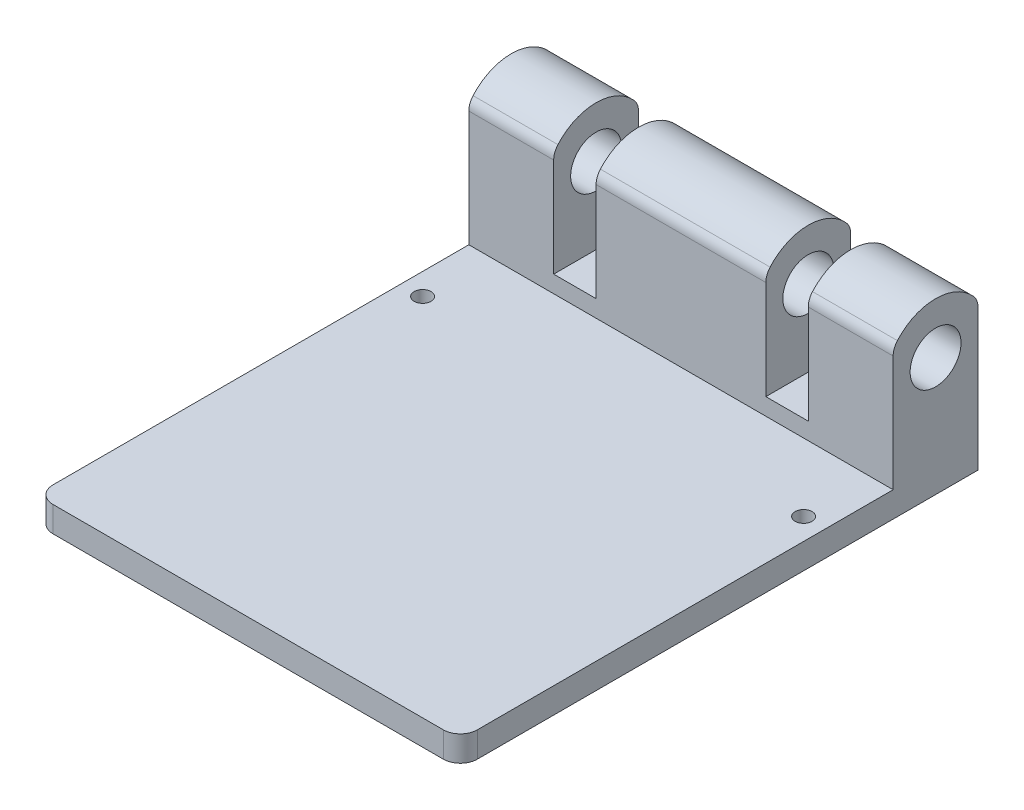
ISO-10303-21;
HEADER;
FILE_DESCRIPTION(('STEP AP214'),'2;1');
FILE_NAME('part.step','',(''),(''),'','','');
FILE_SCHEMA(('AUTOMOTIVE_DESIGN { 1 0 10303 214 1 1 1 1 }'));
ENDSEC;
DATA;
#1=APPLICATION_CONTEXT('core data for automotive mechanical design processes');
#2=APPLICATION_PROTOCOL_DEFINITION('international standard','automotive_design',2000,#1);
#3=PRODUCT_CONTEXT('',#1,'mechanical');
#4=PRODUCT('Part','Part','',(#3));
#5=PRODUCT_RELATED_PRODUCT_CATEGORY('part','',(#4));
#6=PRODUCT_DEFINITION_FORMATION('','',#4);
#7=PRODUCT_DEFINITION_CONTEXT('part definition',#1,'design');
#8=PRODUCT_DEFINITION('design','',#6,#7);
#9=PRODUCT_DEFINITION_SHAPE('','',#8);
#10=(LENGTH_UNIT() NAMED_UNIT(*) SI_UNIT(.MILLI.,.METRE.));
#11=(NAMED_UNIT(*) PLANE_ANGLE_UNIT() SI_UNIT($,.RADIAN.));
#12=(NAMED_UNIT(*) SI_UNIT($,.STERADIAN.) SOLID_ANGLE_UNIT());
#13=UNCERTAINTY_MEASURE_WITH_UNIT(LENGTH_MEASURE(1.E-05),#10,'distance_accuracy_value','');
#14=(GEOMETRIC_REPRESENTATION_CONTEXT(3) GLOBAL_UNCERTAINTY_ASSIGNED_CONTEXT((#13)) GLOBAL_UNIT_ASSIGNED_CONTEXT((#10,
#11,#12)) REPRESENTATION_CONTEXT('',''));
#15=CARTESIAN_POINT('',(0.,0.,0.));
#16=DIRECTION('',(0.,0.,1.));
#17=DIRECTION('',(1.,0.,0.));
#18=AXIS2_PLACEMENT_3D('',#15,#16,#17);
#19=CARTESIAN_POINT('',(25.,20.,5.));
#20=DIRECTION('',(0.,0.,-1.));
#21=DIRECTION('',(-1.,0.,0.));
#22=AXIS2_PLACEMENT_3D('',#19,#20,#21);
#23=PLANE('',#22);
#24=DIRECTION('',(1.,0.,0.));
#25=VECTOR('',#24,1.);
#26=CARTESIAN_POINT('',(-25.,3.,5.));
#27=LINE('',#26,#25);
#28=CARTESIAN_POINT('',(-25.,3.,5.));
#29=VERTEX_POINT('',#28);
#30=CARTESIAN_POINT('',(25.,3.,5.));
#31=VERTEX_POINT('',#30);
#32=EDGE_CURVE('E54',#29,#31,#27,.T.);
#33=ORIENTED_EDGE('',*,*,#32,.T.);
#34=DIRECTION('',(0.,-1.,0.));
#35=VECTOR('',#34,1.);
#36=CARTESIAN_POINT('',(25.,20.,5.));
#37=LINE('',#36,#35);
#38=CARTESIAN_POINT('',(25.,16.6457513110646,5.));
#39=VERTEX_POINT('',#38);
#40=EDGE_CURVE('E301',#39,#31,#37,.T.);
#41=ORIENTED_EDGE('',*,*,#40,.F.);
#42=DIRECTION('',(-1.,0.,0.));
#43=VECTOR('',#42,1.);
#44=CARTESIAN_POINT('',(-45.,16.6457513110646,5.00000000000001));
#45=LINE('',#44,#43);
#46=CARTESIAN_POINT('',(15.,16.6457513110646,5.));
#47=VERTEX_POINT('',#46);
#48=EDGE_CURVE('E344',#39,#47,#45,.T.);
#49=ORIENTED_EDGE('',*,*,#48,.T.);
#50=DIRECTION('',(0.,-1.,0.));
#51=VECTOR('',#50,1.);
#52=CARTESIAN_POINT('',(15.,20.,5.));
#53=LINE('',#52,#51);
#54=CARTESIAN_POINT('',(15.,5.,5.));
#55=VERTEX_POINT('',#54);
#56=EDGE_CURVE('E252',#47,#55,#53,.T.);
#57=ORIENTED_EDGE('',*,*,#56,.T.);
#58=DIRECTION('',(1.,0.,0.));
#59=VECTOR('',#58,1.);
#60=CARTESIAN_POINT('',(9.99999999999999,5.,5.));
#61=LINE('',#60,#59);
#62=CARTESIAN_POINT('',(9.99999999999999,5.,5.));
#63=VERTEX_POINT('',#62);
#64=EDGE_CURVE('E256',#63,#55,#61,.T.);
#65=ORIENTED_EDGE('',*,*,#64,.F.);
#66=DIRECTION('',(0.,-1.,0.));
#67=VECTOR('',#66,1.);
#68=CARTESIAN_POINT('',(10.,20.,5.));
#69=LINE('',#68,#67);
#70=CARTESIAN_POINT('',(10.,16.6457513110646,5.));
#71=VERTEX_POINT('',#70);
#72=EDGE_CURVE('E237',#71,#63,#69,.T.);
#73=ORIENTED_EDGE('',*,*,#72,.F.);
#74=DIRECTION('',(-1.,0.,0.));
#75=VECTOR('',#74,1.);
#76=CARTESIAN_POINT('',(-45.,16.6457513110646,5.00000000000001));
#77=LINE('',#76,#75);
#78=CARTESIAN_POINT('',(-10.,16.6457513110646,5.));
#79=VERTEX_POINT('',#78);
#80=EDGE_CURVE('E335',#71,#79,#77,.T.);
#81=ORIENTED_EDGE('',*,*,#80,.T.);
#82=DIRECTION('',(0.,-1.,0.));
#83=VECTOR('',#82,1.);
#84=CARTESIAN_POINT('',(-10.,20.,5.));
#85=LINE('',#84,#83);
#86=CARTESIAN_POINT('',(-10.,5.,5.));
#87=VERTEX_POINT('',#86);
#88=EDGE_CURVE('E234',#79,#87,#85,.T.);
#89=ORIENTED_EDGE('',*,*,#88,.T.);
#90=DIRECTION('',(1.,0.,0.));
#91=VECTOR('',#90,1.);
#92=CARTESIAN_POINT('',(-15.,5.,5.));
#93=LINE('',#92,#91);
#94=CARTESIAN_POINT('',(-15.,5.,5.));
#95=VERTEX_POINT('',#94);
#96=EDGE_CURVE('E236',#95,#87,#93,.T.);
#97=ORIENTED_EDGE('',*,*,#96,.F.);
#98=DIRECTION('',(0.,-1.,0.));
#99=VECTOR('',#98,1.);
#100=CARTESIAN_POINT('',(-15.,20.,5.));
#101=LINE('',#100,#99);
#102=CARTESIAN_POINT('',(-15.,16.6457513110646,5.));
#103=VERTEX_POINT('',#102);
#104=EDGE_CURVE('E240',#103,#95,#101,.T.);
#105=ORIENTED_EDGE('',*,*,#104,.F.);
#106=DIRECTION('',(-1.,0.,0.));
#107=VECTOR('',#106,1.);
#108=CARTESIAN_POINT('',(-45.,16.6457513110646,5.00000000000001));
#109=LINE('',#108,#107);
#110=CARTESIAN_POINT('',(-25.,16.6457513110646,5.));
#111=VERTEX_POINT('',#110);
#112=EDGE_CURVE('E324',#103,#111,#109,.T.);
#113=ORIENTED_EDGE('',*,*,#112,.T.);
#114=DIRECTION('',(0.,-1.,0.));
#115=VECTOR('',#114,1.);
#116=CARTESIAN_POINT('',(-25.,20.,5.));
#117=LINE('',#116,#115);
#118=EDGE_CURVE('E50',#111,#29,#117,.T.);
#119=ORIENTED_EDGE('',*,*,#118,.T.);
#120=EDGE_LOOP('',(#33,#41,#49,#57,#65,#73,#81,#89,#97,#105,#113,#119));
#121=FACE_BOUND('',#120,.T.);
#122=ADVANCED_FACE('F35',(#121),#23,.F.);
#123=CARTESIAN_POINT('',(-45.,16.6457513110646,-2.99999999999999));
#124=DIRECTION('',(1.,0.,0.));
#125=DIRECTION('',(0.,0.,-1.));
#126=AXIS2_PLACEMENT_3D('',#123,#124,#125);
#127=CYLINDRICAL_SURFACE('',#126,2.);
#128=DIRECTION('',(1.,0.,0.));
#129=VECTOR('',#128,1.);
#130=CARTESIAN_POINT('',(-45.,17.9686269665969,-4.49999999999999));
#131=LINE('',#130,#129);
#132=CARTESIAN_POINT('',(-15.,17.9686269665969,-4.49999999999999));
#133=VERTEX_POINT('',#132);
#134=CARTESIAN_POINT('',(-25.,17.9686269665969,-4.49999999999999));
#135=VERTEX_POINT('',#134);
#136=EDGE_CURVE('E374',#133,#135,#131,.F.);
#137=ORIENTED_EDGE('',*,*,#136,.F.);
#138=CARTESIAN_POINT('',(-15.,16.6457513110646,-2.99999999999999));
#139=DIRECTION('',(-1.,0.,0.));
#140=DIRECTION('',(0.,-1.,0.));
#141=AXIS2_PLACEMENT_3D('',#138,#139,#140);
#142=CIRCLE('',#141,2.);
#143=CARTESIAN_POINT('',(-15.,16.6457513110646,-5.));
#144=VERTEX_POINT('',#143);
#145=EDGE_CURVE('E43',#144,#133,#142,.F.);
#146=ORIENTED_EDGE('',*,*,#145,.F.);
#147=DIRECTION('',(-1.,0.,0.));
#148=VECTOR('',#147,1.);
#149=CARTESIAN_POINT('',(-45.,16.6457513110646,-4.99999999999999));
#150=LINE('',#149,#148);
#151=CARTESIAN_POINT('',(-25.,16.6457513110646,-5.));
#152=VERTEX_POINT('',#151);
#153=EDGE_CURVE('E377',#152,#144,#150,.F.);
#154=ORIENTED_EDGE('',*,*,#153,.F.);
#155=CARTESIAN_POINT('',(-25.,16.6457513110646,-2.99999999999999));
#156=DIRECTION('',(1.,0.,0.));
#157=DIRECTION('',(0.,0.,-1.));
#158=AXIS2_PLACEMENT_3D('',#155,#156,#157);
#159=CIRCLE('',#158,2.);
#160=EDGE_CURVE('E11',#135,#152,#159,.F.);
#161=ORIENTED_EDGE('',*,*,#160,.F.);
#162=EDGE_LOOP('',(#137,#146,#154,#161));
#163=FACE_BOUND('',#162,.T.);
#164=ADVANCED_FACE('F37',(#163),#127,.T.);
#165=CARTESIAN_POINT('',(-45.,16.6457513110646,-2.99999999999999));
#166=DIRECTION('',(1.,0.,0.));
#167=DIRECTION('',(0.,0.,-1.));
#168=AXIS2_PLACEMENT_3D('',#165,#166,#167);
#169=CYLINDRICAL_SURFACE('',#168,2.);
#170=DIRECTION('',(1.,0.,0.));
#171=VECTOR('',#170,1.);
#172=CARTESIAN_POINT('',(-45.,17.9686269665969,-4.49999999999999));
#173=LINE('',#172,#171);
#174=CARTESIAN_POINT('',(10.,17.9686269665969,-4.5));
#175=VERTEX_POINT('',#174);
#176=CARTESIAN_POINT('',(-10.,17.9686269665969,-4.49999999999999));
#177=VERTEX_POINT('',#176);
#178=EDGE_CURVE('E363',#175,#177,#173,.F.);
#179=ORIENTED_EDGE('',*,*,#178,.F.);
#180=CARTESIAN_POINT('',(10.,16.6457513110646,-2.99999999999999));
#181=DIRECTION('',(-1.,0.,0.));
#182=DIRECTION('',(0.,-1.,0.));
#183=AXIS2_PLACEMENT_3D('',#180,#181,#182);
#184=CIRCLE('',#183,2.);
#185=CARTESIAN_POINT('',(10.,16.6457513110646,-5.));
#186=VERTEX_POINT('',#185);
#187=EDGE_CURVE('E372',#186,#175,#184,.F.);
#188=ORIENTED_EDGE('',*,*,#187,.F.);
#189=DIRECTION('',(-1.,0.,0.));
#190=VECTOR('',#189,1.);
#191=CARTESIAN_POINT('',(-45.,16.6457513110646,-4.99999999999999));
#192=LINE('',#191,#190);
#193=CARTESIAN_POINT('',(-10.,16.6457513110646,-5.));
#194=VERTEX_POINT('',#193);
#195=EDGE_CURVE('E369',#194,#186,#192,.F.);
#196=ORIENTED_EDGE('',*,*,#195,.F.);
#197=CARTESIAN_POINT('',(-10.,16.6457513110646,-2.99999999999999));
#198=DIRECTION('',(-1.,0.,0.));
#199=DIRECTION('',(0.,-1.,0.));
#200=AXIS2_PLACEMENT_3D('',#197,#198,#199);
#201=CIRCLE('',#200,2.);
#202=EDGE_CURVE('E366',#177,#194,#201,.T.);
#203=ORIENTED_EDGE('',*,*,#202,.F.);
#204=EDGE_LOOP('',(#179,#188,#196,#203));
#205=FACE_BOUND('',#204,.T.);
#206=ADVANCED_FACE('F448',(#205),#169,.T.);
#207=CARTESIAN_POINT('',(-45.,16.6457513110646,-2.99999999999999));
#208=DIRECTION('',(1.,0.,0.));
#209=DIRECTION('',(0.,0.,-1.));
#210=AXIS2_PLACEMENT_3D('',#207,#208,#209);
#211=CYLINDRICAL_SURFACE('',#210,2.);
#212=DIRECTION('',(1.,0.,0.));
#213=VECTOR('',#212,1.);
#214=CARTESIAN_POINT('',(-45.,17.9686269665969,-4.49999999999999));
#215=LINE('',#214,#213);
#216=CARTESIAN_POINT('',(25.,17.9686269665969,-4.5));
#217=VERTEX_POINT('',#216);
#218=CARTESIAN_POINT('',(15.,17.9686269665969,-4.5));
#219=VERTEX_POINT('',#218);
#220=EDGE_CURVE('E352',#217,#219,#215,.F.);
#221=ORIENTED_EDGE('',*,*,#220,.F.);
#222=CARTESIAN_POINT('',(25.,16.6457513110646,-2.99999999999999));
#223=DIRECTION('',(-1.,0.,0.));
#224=DIRECTION('',(0.,0.,1.));
#225=AXIS2_PLACEMENT_3D('',#222,#223,#224);
#226=CIRCLE('',#225,2.);
#227=CARTESIAN_POINT('',(25.,16.6457513110646,-5.));
#228=VERTEX_POINT('',#227);
#229=EDGE_CURVE('E361',#228,#217,#226,.F.);
#230=ORIENTED_EDGE('',*,*,#229,.F.);
#231=DIRECTION('',(-1.,0.,0.));
#232=VECTOR('',#231,1.);
#233=CARTESIAN_POINT('',(-45.,16.6457513110646,-4.99999999999999));
#234=LINE('',#233,#232);
#235=CARTESIAN_POINT('',(15.,16.6457513110646,-5.));
#236=VERTEX_POINT('',#235);
#237=EDGE_CURVE('E358',#236,#228,#234,.F.);
#238=ORIENTED_EDGE('',*,*,#237,.F.);
#239=CARTESIAN_POINT('',(15.,16.6457513110646,-2.99999999999999));
#240=DIRECTION('',(-1.,0.,0.));
#241=DIRECTION('',(0.,-1.,0.));
#242=AXIS2_PLACEMENT_3D('',#239,#240,#241);
#243=CIRCLE('',#242,2.);
#244=EDGE_CURVE('E355',#219,#236,#243,.T.);
#245=ORIENTED_EDGE('',*,*,#244,.F.);
#246=EDGE_LOOP('',(#221,#230,#238,#245));
#247=FACE_BOUND('',#246,.T.);
#248=ADVANCED_FACE('F452',(#247),#211,.T.);
#249=CARTESIAN_POINT('',(-45.,16.6457513110646,3.00000000000001));
#250=DIRECTION('',(1.,0.,0.));
#251=DIRECTION('',(0.,0.,-1.));
#252=AXIS2_PLACEMENT_3D('',#249,#250,#251);
#253=CYLINDRICAL_SURFACE('',#252,2.);
#254=DIRECTION('',(1.,0.,0.));
#255=VECTOR('',#254,1.);
#256=CARTESIAN_POINT('',(-45.,17.9686269665969,4.50000000000002));
#257=LINE('',#256,#255);
#258=CARTESIAN_POINT('',(15.,17.9686269665965,4.50000000000029));
#259=VERTEX_POINT('',#258);
#260=CARTESIAN_POINT('',(25.,17.9686269665969,4.5));
#261=VERTEX_POINT('',#260);
#262=EDGE_CURVE('E341',#259,#261,#257,.T.);
#263=ORIENTED_EDGE('',*,*,#262,.F.);
#264=CARTESIAN_POINT('',(15.,16.6457513110646,3.00000000000001));
#265=DIRECTION('',(-1.,0.,0.));
#266=DIRECTION('',(0.,-1.,0.));
#267=AXIS2_PLACEMENT_3D('',#264,#265,#266);
#268=CIRCLE('',#267,2.);
#269=EDGE_CURVE('E347',#47,#259,#268,.T.);
#270=ORIENTED_EDGE('',*,*,#269,.F.);
#271=ORIENTED_EDGE('',*,*,#48,.F.);
#272=CARTESIAN_POINT('',(25.,16.6457513110646,3.00000000000001));
#273=DIRECTION('',(-1.,0.,0.));
#274=DIRECTION('',(0.,0.,1.));
#275=AXIS2_PLACEMENT_3D('',#272,#273,#274);
#276=CIRCLE('',#275,2.);
#277=EDGE_CURVE('E350',#261,#39,#276,.F.);
#278=ORIENTED_EDGE('',*,*,#277,.F.);
#279=EDGE_LOOP('',(#263,#270,#271,#278));
#280=FACE_BOUND('',#279,.T.);
#281=ADVANCED_FACE('F455',(#280),#253,.T.);
#282=CARTESIAN_POINT('',(-45.,16.6457513110646,3.00000000000001));
#283=DIRECTION('',(1.,0.,0.));
#284=DIRECTION('',(0.,0.,-1.));
#285=AXIS2_PLACEMENT_3D('',#282,#283,#284);
#286=CYLINDRICAL_SURFACE('',#285,2.);
#287=DIRECTION('',(1.,0.,0.));
#288=VECTOR('',#287,1.);
#289=CARTESIAN_POINT('',(-45.,17.9686269665969,4.50000000000002));
#290=LINE('',#289,#288);
#291=CARTESIAN_POINT('',(-10.,17.9686269665965,4.5000000000003));
#292=VERTEX_POINT('',#291);
#293=CARTESIAN_POINT('',(10.,17.9686269665965,4.50000000000029));
#294=VERTEX_POINT('',#293);
#295=EDGE_CURVE('E329',#292,#294,#290,.T.);
#296=ORIENTED_EDGE('',*,*,#295,.F.);
#297=CARTESIAN_POINT('',(-10.,16.6457513110646,3.00000000000001));
#298=DIRECTION('',(-1.,0.,0.));
#299=DIRECTION('',(0.,-1.,0.));
#300=AXIS2_PLACEMENT_3D('',#297,#298,#299);
#301=CIRCLE('',#300,2.);
#302=EDGE_CURVE('E338',#79,#292,#301,.T.);
#303=ORIENTED_EDGE('',*,*,#302,.F.);
#304=ORIENTED_EDGE('',*,*,#80,.F.);
#305=CARTESIAN_POINT('',(10.,16.6457513110646,3.00000000000001));
#306=DIRECTION('',(-1.,0.,0.));
#307=DIRECTION('',(0.,-1.,0.));
#308=AXIS2_PLACEMENT_3D('',#305,#306,#307);
#309=CIRCLE('',#308,2.);
#310=EDGE_CURVE('E332',#294,#71,#309,.F.);
#311=ORIENTED_EDGE('',*,*,#310,.F.);
#312=EDGE_LOOP('',(#296,#303,#304,#311));
#313=FACE_BOUND('',#312,.T.);
#314=ADVANCED_FACE('F440',(#313),#286,.T.);
#315=CARTESIAN_POINT('',(-45.,16.6457513110646,3.00000000000001));
#316=DIRECTION('',(1.,0.,0.));
#317=DIRECTION('',(0.,0.,-1.));
#318=AXIS2_PLACEMENT_3D('',#315,#316,#317);
#319=CYLINDRICAL_SURFACE('',#318,2.);
#320=DIRECTION('',(1.,0.,0.));
#321=VECTOR('',#320,1.);
#322=CARTESIAN_POINT('',(-45.,17.9686269665969,4.50000000000002));
#323=LINE('',#322,#321);
#324=CARTESIAN_POINT('',(-25.,17.9686269665969,4.50000000000001));
#325=VERTEX_POINT('',#324);
#326=CARTESIAN_POINT('',(-15.,17.9686269665965,4.5000000000003));
#327=VERTEX_POINT('',#326);
#328=EDGE_CURVE('E318',#325,#327,#323,.T.);
#329=ORIENTED_EDGE('',*,*,#328,.F.);
#330=CARTESIAN_POINT('',(-25.,16.6457513110646,3.00000000000001));
#331=DIRECTION('',(1.,0.,0.));
#332=DIRECTION('',(0.,0.,-1.));
#333=AXIS2_PLACEMENT_3D('',#330,#331,#332);
#334=CIRCLE('',#333,2.);
#335=EDGE_CURVE('E326',#111,#325,#334,.F.);
#336=ORIENTED_EDGE('',*,*,#335,.F.);
#337=ORIENTED_EDGE('',*,*,#112,.F.);
#338=CARTESIAN_POINT('',(-15.,16.6457513110646,3.00000000000001));
#339=DIRECTION('',(-1.,0.,0.));
#340=DIRECTION('',(0.,-1.,0.));
#341=AXIS2_PLACEMENT_3D('',#338,#339,#340);
#342=CIRCLE('',#341,2.);
#343=EDGE_CURVE('E321',#327,#103,#342,.F.);
#344=ORIENTED_EDGE('',*,*,#343,.F.);
#345=EDGE_LOOP('',(#329,#336,#337,#344));
#346=FACE_BOUND('',#345,.T.);
#347=ADVANCED_FACE('F393',(#346),#319,.T.);
#348=CARTESIAN_POINT('',(25.,20.,-5.));
#349=DIRECTION('',(0.,0.,1.));
#350=DIRECTION('',(1.,0.,0.));
#351=AXIS2_PLACEMENT_3D('',#348,#349,#350);
#352=PLANE('',#351);
#353=DIRECTION('',(0.,-1.,0.));
#354=VECTOR('',#353,1.);
#355=CARTESIAN_POINT('',(-25.,20.,-5.));
#356=LINE('',#355,#354);
#357=CARTESIAN_POINT('',(-25.,0.,-5.));
#358=VERTEX_POINT('',#357);
#359=EDGE_CURVE('E297',#152,#358,#356,.T.);
#360=ORIENTED_EDGE('',*,*,#359,.F.);
#361=ORIENTED_EDGE('',*,*,#153,.T.);
#362=DIRECTION('',(0.,-1.,0.));
#363=VECTOR('',#362,1.);
#364=CARTESIAN_POINT('',(-15.,20.,-5.));
#365=LINE('',#364,#363);
#366=CARTESIAN_POINT('',(-15.,5.,-5.));
#367=VERTEX_POINT('',#366);
#368=EDGE_CURVE('E272',#144,#367,#365,.T.);
#369=ORIENTED_EDGE('',*,*,#368,.T.);
#370=DIRECTION('',(1.,0.,0.));
#371=VECTOR('',#370,1.);
#372=CARTESIAN_POINT('',(25.,5.00000000000001,-5.));
#373=LINE('',#372,#371);
#374=CARTESIAN_POINT('',(-10.,5.,-5.));
#375=VERTEX_POINT('',#374);
#376=EDGE_CURVE('E315',#367,#375,#373,.T.);
#377=ORIENTED_EDGE('',*,*,#376,.T.);
#378=DIRECTION('',(0.,-1.,0.));
#379=VECTOR('',#378,1.);
#380=CARTESIAN_POINT('',(-10.,20.,-5.));
#381=LINE('',#380,#379);
#382=EDGE_CURVE('E277',#194,#375,#381,.T.);
#383=ORIENTED_EDGE('',*,*,#382,.F.);
#384=ORIENTED_EDGE('',*,*,#195,.T.);
#385=DIRECTION('',(0.,-1.,0.));
#386=VECTOR('',#385,1.);
#387=CARTESIAN_POINT('',(10.,20.,-5.));
#388=LINE('',#387,#386);
#389=CARTESIAN_POINT('',(9.99999999999999,5.,-5.));
#390=VERTEX_POINT('',#389);
#391=EDGE_CURVE('E262',#186,#390,#388,.T.);
#392=ORIENTED_EDGE('',*,*,#391,.T.);
#393=DIRECTION('',(1.,0.,0.));
#394=VECTOR('',#393,1.);
#395=CARTESIAN_POINT('',(25.,5.,-5.));
#396=LINE('',#395,#394);
#397=CARTESIAN_POINT('',(15.,5.,-5.));
#398=VERTEX_POINT('',#397);
#399=EDGE_CURVE('E304',#390,#398,#396,.T.);
#400=ORIENTED_EDGE('',*,*,#399,.T.);
#401=DIRECTION('',(0.,-1.,0.));
#402=VECTOR('',#401,1.);
#403=CARTESIAN_POINT('',(15.,20.,-5.));
#404=LINE('',#403,#402);
#405=EDGE_CURVE('E267',#236,#398,#404,.T.);
#406=ORIENTED_EDGE('',*,*,#405,.F.);
#407=ORIENTED_EDGE('',*,*,#237,.T.);
#408=DIRECTION('',(0.,-1.,0.));
#409=VECTOR('',#408,1.);
#410=CARTESIAN_POINT('',(25.,20.,-5.));
#411=LINE('',#410,#409);
#412=CARTESIAN_POINT('',(25.,0.,-5.));
#413=VERTEX_POINT('',#412);
#414=EDGE_CURVE('E299',#228,#413,#411,.T.);
#415=ORIENTED_EDGE('',*,*,#414,.T.);
#416=DIRECTION('',(-1.,0.,0.));
#417=VECTOR('',#416,1.);
#418=CARTESIAN_POINT('',(25.,0.,-5.));
#419=LINE('',#418,#417);
#420=EDGE_CURVE('E294',#413,#358,#419,.T.);
#421=ORIENTED_EDGE('',*,*,#420,.T.);
#422=EDGE_LOOP('',(#360,#361,#369,#377,#383,#384,#392,#400,#406,#407,#415,#421));
#423=FACE_BOUND('',#422,.T.);
#424=ADVANCED_FACE('F404',(#423),#352,.F.);
#425=CARTESIAN_POINT('',(-45.,14.,0.));
#426=DIRECTION('',(1.,0.,0.));
#427=DIRECTION('',(0.,0.,-1.));
#428=AXIS2_PLACEMENT_3D('',#425,#426,#427);
#429=CYLINDRICAL_SURFACE('',#428,6.);
#430=CARTESIAN_POINT('',(10.,14.,0.));
#431=DIRECTION('',(-1.,0.,0.));
#432=DIRECTION('',(0.,-1.,0.));
#433=AXIS2_PLACEMENT_3D('',#430,#431,#432);
#434=CIRCLE('',#433,6.);
#435=EDGE_CURVE('E260',#175,#294,#434,.F.);
#436=ORIENTED_EDGE('',*,*,#435,.F.);
#437=ORIENTED_EDGE('',*,*,#178,.T.);
#438=CARTESIAN_POINT('',(-10.,14.,0.));
#439=DIRECTION('',(-1.,0.,0.));
#440=DIRECTION('',(0.,-1.,0.));
#441=AXIS2_PLACEMENT_3D('',#438,#439,#440);
#442=CIRCLE('',#441,6.);
#443=EDGE_CURVE('E275',#177,#292,#442,.F.);
#444=ORIENTED_EDGE('',*,*,#443,.T.);
#445=ORIENTED_EDGE('',*,*,#295,.T.);
#446=EDGE_LOOP('',(#436,#437,#444,#445));
#447=FACE_BOUND('',#446,.T.);
#448=ADVANCED_FACE('F442',(#447),#429,.T.);
#449=CARTESIAN_POINT('',(25.,14.,0.));
#450=DIRECTION('',(1.,0.,0.));
#451=DIRECTION('',(0.,0.,-1.));
#452=AXIS2_PLACEMENT_3D('',#449,#450,#451);
#453=CIRCLE('',#452,6.);
#454=EDGE_CURVE('E285',#217,#261,#453,.T.);
#455=ORIENTED_EDGE('',*,*,#454,.F.);
#456=ORIENTED_EDGE('',*,*,#220,.T.);
#457=CARTESIAN_POINT('',(15.,14.,0.));
#458=DIRECTION('',(-1.,0.,0.));
#459=DIRECTION('',(0.,-1.,0.));
#460=AXIS2_PLACEMENT_3D('',#457,#458,#459);
#461=CIRCLE('',#460,6.);
#462=EDGE_CURVE('E265',#219,#259,#461,.F.);
#463=ORIENTED_EDGE('',*,*,#462,.T.);
#464=ORIENTED_EDGE('',*,*,#262,.T.);
#465=EDGE_LOOP('',(#455,#456,#463,#464));
#466=FACE_BOUND('',#465,.T.);
#467=ADVANCED_FACE('F454',(#466),#429,.T.);
#468=CARTESIAN_POINT('',(-45.,14.,0.));
#469=DIRECTION('',(1.,0.,0.));
#470=DIRECTION('',(0.,0.,-1.));
#471=AXIS2_PLACEMENT_3D('',#468,#469,#470);
#472=CYLINDRICAL_SURFACE('',#471,3.);
#473=CARTESIAN_POINT('',(25.,14.,0.));
#474=DIRECTION('',(1.,0.,0.));
#475=DIRECTION('',(0.,0.,-1.));
#476=AXIS2_PLACEMENT_3D('',#473,#474,#475);
#477=CIRCLE('',#476,3.);
#478=CARTESIAN_POINT('',(25.,14.,-3.00000000000001));
#479=VERTEX_POINT('',#478);
#480=EDGE_CURVE('E279',#479,#479,#477,.T.);
#481=ORIENTED_EDGE('',*,*,#480,.T.);
#482=EDGE_LOOP('',(#481));
#483=FACE_BOUND('',#482,.T.);
#484=CARTESIAN_POINT('',(15.,14.,0.));
#485=DIRECTION('',(-1.,0.,0.));
#486=DIRECTION('',(0.,-1.,0.));
#487=AXIS2_PLACEMENT_3D('',#484,#485,#486);
#488=CIRCLE('',#487,3.);
#489=CARTESIAN_POINT('',(15.,11.,0.));
#490=VERTEX_POINT('',#489);
#491=EDGE_CURVE('E264',#490,#490,#488,.F.);
#492=ORIENTED_EDGE('',*,*,#491,.F.);
#493=EDGE_LOOP('',(#492));
#494=FACE_BOUND('',#493,.T.);
#495=ADVANCED_FACE('F474',(#483,#494),#472,.F.);
#496=CARTESIAN_POINT('',(-25.,20.,5.));
#497=DIRECTION('',(1.,0.,0.));
#498=DIRECTION('',(0.,0.,-1.));
#499=AXIS2_PLACEMENT_3D('',#496,#497,#498);
#500=PLANE('',#499);
#501=CARTESIAN_POINT('',(-25.,14.,0.));
#502=DIRECTION('',(1.,0.,0.));
#503=DIRECTION('',(0.,0.,-1.));
#504=AXIS2_PLACEMENT_3D('',#501,#502,#503);
#505=CIRCLE('',#504,3.);
#506=CARTESIAN_POINT('',(-25.,14.,-3.00000000000001));
#507=VERTEX_POINT('',#506);
#508=EDGE_CURVE('E282',#507,#507,#505,.T.);
#509=ORIENTED_EDGE('',*,*,#508,.T.);
#510=EDGE_LOOP('',(#509));
#511=FACE_BOUND('',#510,.T.);
#512=CARTESIAN_POINT('',(-25.,14.,0.));
#513=DIRECTION('',(1.,0.,0.));
#514=DIRECTION('',(0.,0.,-1.));
#515=AXIS2_PLACEMENT_3D('',#512,#513,#514);
#516=CIRCLE('',#515,6.);
#517=EDGE_CURVE('E287',#135,#325,#516,.T.);
#518=ORIENTED_EDGE('',*,*,#517,.F.);
#519=ORIENTED_EDGE('',*,*,#160,.T.);
#520=ORIENTED_EDGE('',*,*,#359,.T.);
#521=DIRECTION('',(0.,0.,1.));
#522=VECTOR('',#521,1.);
#523=CARTESIAN_POINT('',(-25.,0.,5.));
#524=LINE('',#523,#522);
#525=CARTESIAN_POINT('',(-25.,0.,54.));
#526=VERTEX_POINT('',#525);
#527=EDGE_CURVE('E289',#358,#526,#524,.T.);
#528=ORIENTED_EDGE('',*,*,#527,.T.);
#529=DIRECTION('',(0.,-1.,0.));
#530=VECTOR('',#529,1.);
#531=CARTESIAN_POINT('',(-25.,3.,54.));
#532=LINE('',#531,#530);
#533=CARTESIAN_POINT('',(-25.,3.,54.));
#534=VERTEX_POINT('',#533);
#535=EDGE_CURVE('E230',#534,#526,#532,.T.);
#536=ORIENTED_EDGE('',*,*,#535,.F.);
#537=DIRECTION('',(0.,0.,-1.));
#538=VECTOR('',#537,1.);
#539=CARTESIAN_POINT('',(-25.,3.,5.));
#540=LINE('',#539,#538);
#541=EDGE_CURVE('E219',#534,#29,#540,.T.);
#542=ORIENTED_EDGE('',*,*,#541,.T.);
#543=ORIENTED_EDGE('',*,*,#118,.F.);
#544=ORIENTED_EDGE('',*,*,#335,.T.);
#545=EDGE_LOOP('',(#518,#519,#520,#528,#536,#542,#543,#544));
#546=FACE_BOUND('',#545,.T.);
#547=ADVANCED_FACE('F408',(#511,#546),#500,.F.);
#548=CARTESIAN_POINT('',(25.,20.,5.));
#549=DIRECTION('',(-1.,0.,0.));
#550=DIRECTION('',(0.,0.,1.));
#551=AXIS2_PLACEMENT_3D('',#548,#549,#550);
#552=PLANE('',#551);
#553=ORIENTED_EDGE('',*,*,#480,.F.);
#554=EDGE_LOOP('',(#553));
#555=FACE_BOUND('',#554,.T.);
#556=ORIENTED_EDGE('',*,*,#414,.F.);
#557=ORIENTED_EDGE('',*,*,#229,.T.);
#558=ORIENTED_EDGE('',*,*,#454,.T.);
#559=ORIENTED_EDGE('',*,*,#277,.T.);
#560=ORIENTED_EDGE('',*,*,#40,.T.);
#561=DIRECTION('',(0.,0.,1.));
#562=VECTOR('',#561,1.);
#563=CARTESIAN_POINT('',(25.,3.,5.));
#564=LINE('',#563,#562);
#565=CARTESIAN_POINT('',(25.,3.,54.));
#566=VERTEX_POINT('',#565);
#567=EDGE_CURVE('E194',#31,#566,#564,.T.);
#568=ORIENTED_EDGE('',*,*,#567,.T.);
#569=DIRECTION('',(0.,-1.,0.));
#570=VECTOR('',#569,1.);
#571=CARTESIAN_POINT('',(25.,3.,54.));
#572=LINE('',#571,#570);
#573=CARTESIAN_POINT('',(25.,0.,54.));
#574=VERTEX_POINT('',#573);
#575=EDGE_CURVE('E209',#566,#574,#572,.T.);
#576=ORIENTED_EDGE('',*,*,#575,.T.);
#577=DIRECTION('',(0.,0.,-1.));
#578=VECTOR('',#577,1.);
#579=CARTESIAN_POINT('',(25.,0.,5.));
#580=LINE('',#579,#578);
#581=EDGE_CURVE('E291',#574,#413,#580,.T.);
#582=ORIENTED_EDGE('',*,*,#581,.T.);
#583=EDGE_LOOP('',(#556,#557,#558,#559,#560,#568,#576,#582));
#584=FACE_BOUND('',#583,.T.);
#585=ADVANCED_FACE('F416',(#555,#584),#552,.F.);
#586=CARTESIAN_POINT('',(0.,0.,0.));
#587=DIRECTION('',(0.,1.,0.));
#588=DIRECTION('',(0.,0.,1.));
#589=AXIS2_PLACEMENT_3D('',#586,#587,#588);
#590=PLANE('',#589);
#591=CARTESIAN_POINT('',(-22.45,0.,13.));
#592=DIRECTION('',(0.,1.,0.));
#593=DIRECTION('',(0.,0.,1.));
#594=AXIS2_PLACEMENT_3D('',#591,#592,#593);
#595=CIRCLE('',#594,1.);
#596=CARTESIAN_POINT('',(-22.45,0.,14.));
#597=VERTEX_POINT('',#596);
#598=EDGE_CURVE('E226',#597,#597,#595,.T.);
#599=ORIENTED_EDGE('',*,*,#598,.T.);
#600=EDGE_LOOP('',(#599));
#601=FACE_BOUND('',#600,.T.);
#602=CARTESIAN_POINT('',(22.45,0.,13.));
#603=DIRECTION('',(0.,1.,0.));
#604=DIRECTION('',(0.,0.,1.));
#605=AXIS2_PLACEMENT_3D('',#602,#603,#604);
#606=CIRCLE('',#605,1.);
#607=CARTESIAN_POINT('',(22.45,0.,14.));
#608=VERTEX_POINT('',#607);
#609=EDGE_CURVE('E534',#608,#608,#606,.T.);
#610=ORIENTED_EDGE('',*,*,#609,.T.);
#611=EDGE_LOOP('',(#610));
#612=FACE_BOUND('',#611,.T.);
#613=ORIENTED_EDGE('',*,*,#527,.F.);
#614=ORIENTED_EDGE('',*,*,#420,.F.);
#615=ORIENTED_EDGE('',*,*,#581,.F.);
#616=CARTESIAN_POINT('',(23.,0.,54.));
#617=DIRECTION('',(0.,-1.,0.));
#618=DIRECTION('',(0.,0.,-1.));
#619=AXIS2_PLACEMENT_3D('',#616,#617,#618);
#620=CIRCLE('',#619,2.);
#621=CARTESIAN_POINT('',(23.,0.,56.));
#622=VERTEX_POINT('',#621);
#623=EDGE_CURVE('E224',#574,#622,#620,.T.);
#624=ORIENTED_EDGE('',*,*,#623,.T.);
#625=DIRECTION('',(-1.,0.,0.));
#626=VECTOR('',#625,1.);
#627=CARTESIAN_POINT('',(-23.,0.,56.));
#628=LINE('',#627,#626);
#629=CARTESIAN_POINT('',(-23.,0.,56.));
#630=VERTEX_POINT('',#629);
#631=EDGE_CURVE('E188',#622,#630,#628,.T.);
#632=ORIENTED_EDGE('',*,*,#631,.T.);
#633=CARTESIAN_POINT('',(-23.,0.,54.));
#634=DIRECTION('',(0.,-1.,0.));
#635=DIRECTION('',(0.,0.,1.));
#636=AXIS2_PLACEMENT_3D('',#633,#634,#635);
#637=CIRCLE('',#636,2.);
#638=EDGE_CURVE('E210',#630,#526,#637,.T.);
#639=ORIENTED_EDGE('',*,*,#638,.T.);
#640=EDGE_LOOP('',(#613,#614,#615,#624,#632,#639));
#641=FACE_BOUND('',#640,.T.);
#642=ADVANCED_FACE('F413',(#601,#612,#641),#590,.F.);
#643=CARTESIAN_POINT('',(-15.,14.,0.));
#644=DIRECTION('',(-1.,0.,0.));
#645=DIRECTION('',(0.,-1.,0.));
#646=AXIS2_PLACEMENT_3D('',#643,#644,#645);
#647=CIRCLE('',#646,6.);
#648=EDGE_CURVE('E270',#133,#327,#647,.F.);
#649=ORIENTED_EDGE('',*,*,#648,.F.);
#650=ORIENTED_EDGE('',*,*,#136,.T.);
#651=ORIENTED_EDGE('',*,*,#517,.T.);
#652=ORIENTED_EDGE('',*,*,#328,.T.);
#653=EDGE_LOOP('',(#649,#650,#651,#652));
#654=FACE_BOUND('',#653,.T.);
#655=ADVANCED_FACE('F390',(#654),#429,.T.);
#656=CARTESIAN_POINT('',(-15.,14.,0.));
#657=DIRECTION('',(-1.,0.,0.));
#658=DIRECTION('',(0.,-1.,0.));
#659=AXIS2_PLACEMENT_3D('',#656,#657,#658);
#660=CIRCLE('',#659,3.);
#661=CARTESIAN_POINT('',(-15.,11.,0.));
#662=VERTEX_POINT('',#661);
#663=EDGE_CURVE('E269',#662,#662,#660,.F.);
#664=ORIENTED_EDGE('',*,*,#663,.T.);
#665=EDGE_LOOP('',(#664));
#666=FACE_BOUND('',#665,.T.);
#667=ORIENTED_EDGE('',*,*,#508,.F.);
#668=EDGE_LOOP('',(#667));
#669=FACE_BOUND('',#668,.T.);
#670=ADVANCED_FACE('F489',(#666,#669),#472,.F.);
#671=CARTESIAN_POINT('',(9.99999999999999,5.,-15.));
#672=DIRECTION('',(0.,-1.,0.));
#673=DIRECTION('',(1.,0.,0.));
#674=AXIS2_PLACEMENT_3D('',#671,#672,#673);
#675=PLANE('',#674);
#676=DIRECTION('',(0.,0.,1.));
#677=VECTOR('',#676,1.);
#678=CARTESIAN_POINT('',(9.99999999999999,5.,-15.));
#679=LINE('',#678,#677);
#680=EDGE_CURVE('E249',#390,#63,#679,.T.);
#681=ORIENTED_EDGE('',*,*,#680,.T.);
#682=ORIENTED_EDGE('',*,*,#64,.T.);
#683=DIRECTION('',(0.,0.,1.));
#684=VECTOR('',#683,1.);
#685=CARTESIAN_POINT('',(15.,5.,-15.));
#686=LINE('',#685,#684);
#687=EDGE_CURVE('E229',#398,#55,#686,.T.);
#688=ORIENTED_EDGE('',*,*,#687,.F.);
#689=ORIENTED_EDGE('',*,*,#399,.F.);
#690=EDGE_LOOP('',(#681,#682,#688,#689));
#691=FACE_BOUND('',#690,.T.);
#692=ADVANCED_FACE('F430',(#691),#675,.F.);
#693=CARTESIAN_POINT('',(15.,20.,-15.));
#694=DIRECTION('',(-1.,0.,0.));
#695=DIRECTION('',(0.,-1.,0.));
#696=AXIS2_PLACEMENT_3D('',#693,#694,#695);
#697=PLANE('',#696);
#698=ORIENTED_EDGE('',*,*,#491,.T.);
#699=EDGE_LOOP('',(#698));
#700=FACE_BOUND('',#699,.T.);
#701=ORIENTED_EDGE('',*,*,#462,.F.);
#702=ORIENTED_EDGE('',*,*,#244,.T.);
#703=ORIENTED_EDGE('',*,*,#405,.T.);
#704=ORIENTED_EDGE('',*,*,#687,.T.);
#705=ORIENTED_EDGE('',*,*,#56,.F.);
#706=ORIENTED_EDGE('',*,*,#269,.T.);
#707=EDGE_LOOP('',(#701,#702,#703,#704,#705,#706));
#708=FACE_BOUND('',#707,.T.);
#709=ADVANCED_FACE('F424',(#700,#708),#697,.T.);
#710=CARTESIAN_POINT('',(10.,20.,-15.));
#711=DIRECTION('',(-1.,0.,0.));
#712=DIRECTION('',(0.,-1.,0.));
#713=AXIS2_PLACEMENT_3D('',#710,#711,#712);
#714=PLANE('',#713);
#715=CARTESIAN_POINT('',(10.,14.,0.));
#716=DIRECTION('',(-1.,0.,0.));
#717=DIRECTION('',(0.,-1.,0.));
#718=AXIS2_PLACEMENT_3D('',#715,#716,#717);
#719=CIRCLE('',#718,3.);
#720=CARTESIAN_POINT('',(10.,11.,0.));
#721=VERTEX_POINT('',#720);
#722=EDGE_CURVE('E248',#721,#721,#719,.F.);
#723=ORIENTED_EDGE('',*,*,#722,.F.);
#724=EDGE_LOOP('',(#723));
#725=FACE_BOUND('',#724,.T.);
#726=ORIENTED_EDGE('',*,*,#391,.F.);
#727=ORIENTED_EDGE('',*,*,#187,.T.);
#728=ORIENTED_EDGE('',*,*,#435,.T.);
#729=ORIENTED_EDGE('',*,*,#310,.T.);
#730=ORIENTED_EDGE('',*,*,#72,.T.);
#731=ORIENTED_EDGE('',*,*,#680,.F.);
#732=EDGE_LOOP('',(#726,#727,#728,#729,#730,#731));
#733=FACE_BOUND('',#732,.T.);
#734=ADVANCED_FACE('F435',(#725,#733),#714,.F.);
#735=CARTESIAN_POINT('',(-15.,5.,-15.));
#736=DIRECTION('',(0.,-1.,0.));
#737=DIRECTION('',(1.,0.,0.));
#738=AXIS2_PLACEMENT_3D('',#735,#736,#737);
#739=PLANE('',#738);
#740=DIRECTION('',(0.,0.,1.));
#741=VECTOR('',#740,1.);
#742=CARTESIAN_POINT('',(-15.,5.,-15.));
#743=LINE('',#742,#741);
#744=EDGE_CURVE('E242',#367,#95,#743,.T.);
#745=ORIENTED_EDGE('',*,*,#744,.T.);
#746=ORIENTED_EDGE('',*,*,#96,.T.);
#747=DIRECTION('',(0.,0.,1.));
#748=VECTOR('',#747,1.);
#749=CARTESIAN_POINT('',(-10.,5.,-15.));
#750=LINE('',#749,#748);
#751=EDGE_CURVE('E245',#375,#87,#750,.T.);
#752=ORIENTED_EDGE('',*,*,#751,.F.);
#753=ORIENTED_EDGE('',*,*,#376,.F.);
#754=EDGE_LOOP('',(#745,#746,#752,#753));
#755=FACE_BOUND('',#754,.T.);
#756=ADVANCED_FACE('F399',(#755),#739,.F.);
#757=CARTESIAN_POINT('',(-10.,20.,-15.));
#758=DIRECTION('',(-1.,0.,0.));
#759=DIRECTION('',(0.,-1.,0.));
#760=AXIS2_PLACEMENT_3D('',#757,#758,#759);
#761=PLANE('',#760);
#762=CARTESIAN_POINT('',(-10.,14.,0.));
#763=DIRECTION('',(-1.,0.,0.));
#764=DIRECTION('',(0.,-1.,0.));
#765=AXIS2_PLACEMENT_3D('',#762,#763,#764);
#766=CIRCLE('',#765,3.);
#767=CARTESIAN_POINT('',(-10.,11.,0.));
#768=VERTEX_POINT('',#767);
#769=EDGE_CURVE('E274',#768,#768,#766,.F.);
#770=ORIENTED_EDGE('',*,*,#769,.T.);
#771=EDGE_LOOP('',(#770));
#772=FACE_BOUND('',#771,.T.);
#773=ORIENTED_EDGE('',*,*,#443,.F.);
#774=ORIENTED_EDGE('',*,*,#202,.T.);
#775=ORIENTED_EDGE('',*,*,#382,.T.);
#776=ORIENTED_EDGE('',*,*,#751,.T.);
#777=ORIENTED_EDGE('',*,*,#88,.F.);
#778=ORIENTED_EDGE('',*,*,#302,.T.);
#779=EDGE_LOOP('',(#773,#774,#775,#776,#777,#778));
#780=FACE_BOUND('',#779,.T.);
#781=ADVANCED_FACE('F446',(#772,#780),#761,.T.);
#782=CARTESIAN_POINT('',(-15.,20.,-15.));
#783=DIRECTION('',(-1.,0.,0.));
#784=DIRECTION('',(0.,-1.,0.));
#785=AXIS2_PLACEMENT_3D('',#782,#783,#784);
#786=PLANE('',#785);
#787=ORIENTED_EDGE('',*,*,#663,.F.);
#788=EDGE_LOOP('',(#787));
#789=FACE_BOUND('',#788,.T.);
#790=ORIENTED_EDGE('',*,*,#368,.F.);
#791=ORIENTED_EDGE('',*,*,#145,.T.);
#792=ORIENTED_EDGE('',*,*,#648,.T.);
#793=ORIENTED_EDGE('',*,*,#343,.T.);
#794=ORIENTED_EDGE('',*,*,#104,.T.);
#795=ORIENTED_EDGE('',*,*,#744,.F.);
#796=EDGE_LOOP('',(#790,#791,#792,#793,#794,#795));
#797=FACE_BOUND('',#796,.T.);
#798=ADVANCED_FACE('F382',(#789,#797),#786,.F.);
#799=ORIENTED_EDGE('',*,*,#722,.T.);
#800=EDGE_LOOP('',(#799));
#801=FACE_BOUND('',#800,.T.);
#802=ORIENTED_EDGE('',*,*,#769,.F.);
#803=EDGE_LOOP('',(#802));
#804=FACE_BOUND('',#803,.T.);
#805=ADVANCED_FACE('F493',(#801,#804),#472,.F.);
#806=CARTESIAN_POINT('',(23.,3.,54.));
#807=DIRECTION('',(0.,-1.,0.));
#808=DIRECTION('',(0.,0.,-1.));
#809=AXIS2_PLACEMENT_3D('',#806,#807,#808);
#810=CYLINDRICAL_SURFACE('',#809,2.);
#811=ORIENTED_EDGE('',*,*,#623,.F.);
#812=ORIENTED_EDGE('',*,*,#575,.F.);
#813=CARTESIAN_POINT('',(23.,3.,54.));
#814=DIRECTION('',(0.,-1.,0.));
#815=DIRECTION('',(0.,0.,-1.));
#816=AXIS2_PLACEMENT_3D('',#813,#814,#815);
#817=CIRCLE('',#816,2.);
#818=CARTESIAN_POINT('',(23.,3.,56.));
#819=VERTEX_POINT('',#818);
#820=EDGE_CURVE('E201',#566,#819,#817,.T.);
#821=ORIENTED_EDGE('',*,*,#820,.T.);
#822=DIRECTION('',(0.,-1.,0.));
#823=VECTOR('',#822,1.);
#824=CARTESIAN_POINT('',(23.,3.,56.));
#825=LINE('',#824,#823);
#826=EDGE_CURVE('E183',#819,#622,#825,.T.);
#827=ORIENTED_EDGE('',*,*,#826,.T.);
#828=EDGE_LOOP('',(#811,#812,#821,#827));
#829=FACE_BOUND('',#828,.T.);
#830=ADVANCED_FACE('F207',(#829),#810,.T.);
#831=CARTESIAN_POINT('',(-23.,3.,54.));
#832=DIRECTION('',(0.,-1.,0.));
#833=DIRECTION('',(0.,0.,-1.));
#834=AXIS2_PLACEMENT_3D('',#831,#832,#833);
#835=CYLINDRICAL_SURFACE('',#834,2.);
#836=ORIENTED_EDGE('',*,*,#638,.F.);
#837=DIRECTION('',(0.,-1.,0.));
#838=VECTOR('',#837,1.);
#839=CARTESIAN_POINT('',(-23.,3.,56.));
#840=LINE('',#839,#838);
#841=CARTESIAN_POINT('',(-23.,3.,56.));
#842=VERTEX_POINT('',#841);
#843=EDGE_CURVE('E193',#842,#630,#840,.T.);
#844=ORIENTED_EDGE('',*,*,#843,.F.);
#845=CARTESIAN_POINT('',(-23.,3.,54.));
#846=DIRECTION('',(0.,-1.,0.));
#847=DIRECTION('',(0.,0.,1.));
#848=AXIS2_PLACEMENT_3D('',#845,#846,#847);
#849=CIRCLE('',#848,2.);
#850=EDGE_CURVE('E205',#842,#534,#849,.T.);
#851=ORIENTED_EDGE('',*,*,#850,.T.);
#852=ORIENTED_EDGE('',*,*,#535,.T.);
#853=EDGE_LOOP('',(#836,#844,#851,#852));
#854=FACE_BOUND('',#853,.T.);
#855=ADVANCED_FACE('F411',(#854),#835,.T.);
#856=CARTESIAN_POINT('',(-23.,3.,56.));
#857=DIRECTION('',(0.,0.,1.));
#858=DIRECTION('',(1.,0.,0.));
#859=AXIS2_PLACEMENT_3D('',#856,#857,#858);
#860=PLANE('',#859);
#861=ORIENTED_EDGE('',*,*,#631,.F.);
#862=ORIENTED_EDGE('',*,*,#826,.F.);
#863=DIRECTION('',(-1.,0.,0.));
#864=VECTOR('',#863,1.);
#865=CARTESIAN_POINT('',(-23.,3.,56.));
#866=LINE('',#865,#864);
#867=EDGE_CURVE('E186',#819,#842,#866,.T.);
#868=ORIENTED_EDGE('',*,*,#867,.T.);
#869=ORIENTED_EDGE('',*,*,#843,.T.);
#870=EDGE_LOOP('',(#861,#862,#868,#869));
#871=FACE_BOUND('',#870,.T.);
#872=ADVANCED_FACE('F185',(#871),#860,.T.);
#873=CARTESIAN_POINT('',(23.,3.,54.));
#874=DIRECTION('',(0.,-1.,0.));
#875=DIRECTION('',(0.,0.,-1.));
#876=AXIS2_PLACEMENT_3D('',#873,#874,#875);
#877=PLANE('',#876);
#878=CARTESIAN_POINT('',(-22.45,3.,13.));
#879=DIRECTION('',(0.,1.,0.));
#880=DIRECTION('',(0.,0.,1.));
#881=AXIS2_PLACEMENT_3D('',#878,#879,#880);
#882=CIRCLE('',#881,1.);
#883=CARTESIAN_POINT('',(-22.45,3.,14.));
#884=VERTEX_POINT('',#883);
#885=EDGE_CURVE('E533',#884,#884,#882,.T.);
#886=ORIENTED_EDGE('',*,*,#885,.F.);
#887=EDGE_LOOP('',(#886));
#888=FACE_BOUND('',#887,.T.);
#889=CARTESIAN_POINT('',(22.45,3.,13.));
#890=DIRECTION('',(0.,1.,0.));
#891=DIRECTION('',(0.,0.,1.));
#892=AXIS2_PLACEMENT_3D('',#889,#890,#891);
#893=CIRCLE('',#892,1.);
#894=CARTESIAN_POINT('',(22.45,3.,14.));
#895=VERTEX_POINT('',#894);
#896=EDGE_CURVE('E215',#895,#895,#893,.T.);
#897=ORIENTED_EDGE('',*,*,#896,.F.);
#898=EDGE_LOOP('',(#897));
#899=FACE_BOUND('',#898,.T.);
#900=ORIENTED_EDGE('',*,*,#820,.F.);
#901=ORIENTED_EDGE('',*,*,#567,.F.);
#902=ORIENTED_EDGE('',*,*,#32,.F.);
#903=ORIENTED_EDGE('',*,*,#541,.F.);
#904=ORIENTED_EDGE('',*,*,#850,.F.);
#905=ORIENTED_EDGE('',*,*,#867,.F.);
#906=EDGE_LOOP('',(#900,#901,#902,#903,#904,#905));
#907=FACE_BOUND('',#906,.T.);
#908=ADVANCED_FACE('F199',(#888,#899,#907),#877,.F.);
#909=CARTESIAN_POINT('',(22.45,0.,13.));
#910=DIRECTION('',(0.,1.,0.));
#911=DIRECTION('',(0.,0.,1.));
#912=AXIS2_PLACEMENT_3D('',#909,#910,#911);
#913=CYLINDRICAL_SURFACE('',#912,1.);
#914=ORIENTED_EDGE('',*,*,#609,.F.);
#915=EDGE_LOOP('',(#914));
#916=FACE_BOUND('',#915,.T.);
#917=ORIENTED_EDGE('',*,*,#896,.T.);
#918=EDGE_LOOP('',(#917));
#919=FACE_BOUND('',#918,.T.);
#920=ADVANCED_FACE('F518',(#916,#919),#913,.F.);
#921=CARTESIAN_POINT('',(-22.45,0.,13.));
#922=DIRECTION('',(0.,1.,0.));
#923=DIRECTION('',(0.,0.,1.));
#924=AXIS2_PLACEMENT_3D('',#921,#922,#923);
#925=CYLINDRICAL_SURFACE('',#924,1.);
#926=ORIENTED_EDGE('',*,*,#598,.F.);
#927=EDGE_LOOP('',(#926));
#928=FACE_BOUND('',#927,.T.);
#929=ORIENTED_EDGE('',*,*,#885,.T.);
#930=EDGE_LOOP('',(#929));
#931=FACE_BOUND('',#930,.T.);
#932=ADVANCED_FACE('F522',(#928,#931),#925,.F.);
#933=CLOSED_SHELL('',(#122,#164,#206,#248,#281,#314,#347,#424,#448,#467,#495,#547,#585,#642,
#655,#670,#692,#709,#734,#756,#781,#798,#805,#830,#855,#872,#908,#920,#932));
#934=MANIFOLD_SOLID_BREP('B2',#933);
#935=ADVANCED_BREP_SHAPE_REPRESENTATION('',(#18,#934),#14);
#936=SHAPE_DEFINITION_REPRESENTATION(#9,#935);
ENDSEC;
END-ISO-10303-21;
